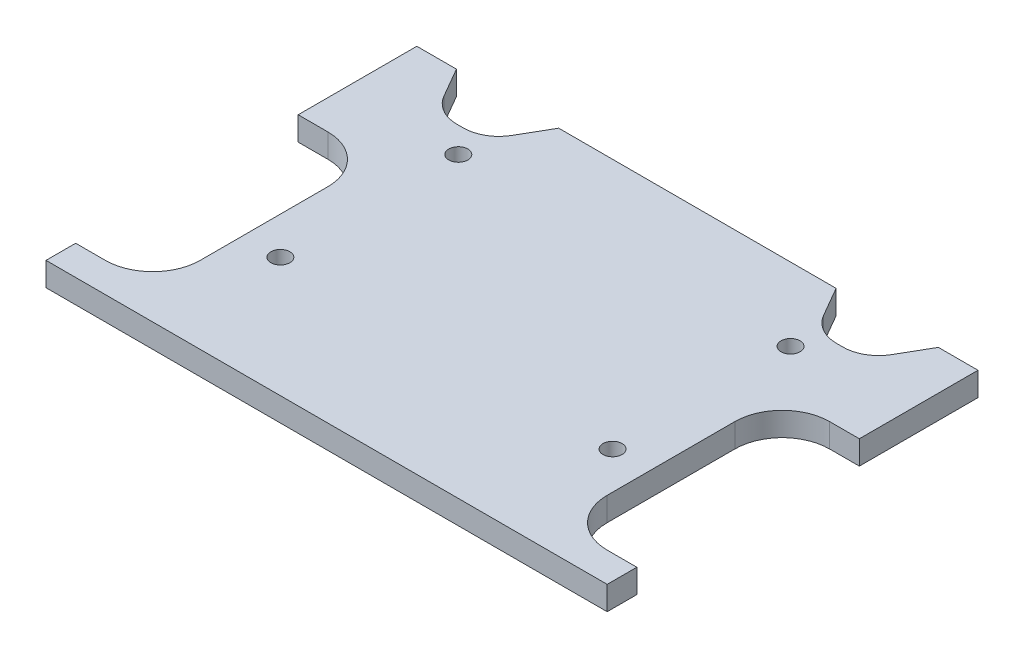
ISO-10303-21;
HEADER;
FILE_DESCRIPTION(('STEP AP214'),'2;1');
FILE_NAME('part.step','',(''),(''),'','','');
FILE_SCHEMA(('AUTOMOTIVE_DESIGN { 1 0 10303 214 1 1 1 1 }'));
ENDSEC;
DATA;
#1=APPLICATION_CONTEXT('core data for automotive mechanical design processes');
#2=APPLICATION_PROTOCOL_DEFINITION('international standard','automotive_design',2000,#1);
#3=PRODUCT_CONTEXT('',#1,'mechanical');
#4=PRODUCT('Part','Part','',(#3));
#5=PRODUCT_RELATED_PRODUCT_CATEGORY('part','',(#4));
#6=PRODUCT_DEFINITION_FORMATION('','',#4);
#7=PRODUCT_DEFINITION_CONTEXT('part definition',#1,'design');
#8=PRODUCT_DEFINITION('design','',#6,#7);
#9=PRODUCT_DEFINITION_SHAPE('','',#8);
#10=(LENGTH_UNIT() NAMED_UNIT(*) SI_UNIT(.MILLI.,.METRE.));
#11=(NAMED_UNIT(*) PLANE_ANGLE_UNIT() SI_UNIT($,.RADIAN.));
#12=(NAMED_UNIT(*) SI_UNIT($,.STERADIAN.) SOLID_ANGLE_UNIT());
#13=UNCERTAINTY_MEASURE_WITH_UNIT(LENGTH_MEASURE(1.E-05),#10,'distance_accuracy_value','');
#14=(GEOMETRIC_REPRESENTATION_CONTEXT(3) GLOBAL_UNCERTAINTY_ASSIGNED_CONTEXT((#13)) GLOBAL_UNIT_ASSIGNED_CONTEXT((#10,
#11,#12)) REPRESENTATION_CONTEXT('',''));
#15=CARTESIAN_POINT('',(0.,0.,0.));
#16=DIRECTION('',(0.,0.,1.));
#17=DIRECTION('',(1.,0.,0.));
#18=AXIS2_PLACEMENT_3D('',#15,#16,#17);
#19=CARTESIAN_POINT('',(-75.0855000000001,6.35,-27.7827342428377));
#20=DIRECTION('',(1.,0.,0.));
#21=DIRECTION('',(0.,0.,-1.));
#22=AXIS2_PLACEMENT_3D('',#19,#20,#21);
#23=PLANE('',#22);
#24=DIRECTION('',(0.,0.,1.));
#25=VECTOR('',#24,1.);
#26=CARTESIAN_POINT('',(-75.0855000000001,0.,-27.7827342428377));
#27=LINE('',#26,#25);
#28=CARTESIAN_POINT('',(-75.0855000000001,0.,-27.7827342428377));
#29=VERTEX_POINT('',#28);
#30=CARTESIAN_POINT('',(-75.0855000000001,0.,3.96726575716246));
#31=VERTEX_POINT('',#30);
#32=EDGE_CURVE('E256',#29,#31,#27,.T.);
#33=ORIENTED_EDGE('',*,*,#32,.T.);
#34=DIRECTION('',(0.,-1.,0.));
#35=VECTOR('',#34,1.);
#36=CARTESIAN_POINT('',(-75.0855000000001,6.35,3.96726575716246));
#37=LINE('',#36,#35);
#38=CARTESIAN_POINT('',(-75.0855000000001,6.35,3.96726575716246));
#39=VERTEX_POINT('',#38);
#40=EDGE_CURVE('E11',#39,#31,#37,.T.);
#41=ORIENTED_EDGE('',*,*,#40,.F.);
#42=DIRECTION('',(0.,0.,1.));
#43=VECTOR('',#42,1.);
#44=CARTESIAN_POINT('',(-75.0855000000001,6.35,-27.7827342428377));
#45=LINE('',#44,#43);
#46=CARTESIAN_POINT('',(-75.0855000000001,6.35,-27.7827342428377));
#47=VERTEX_POINT('',#46);
#48=EDGE_CURVE('E313',#47,#39,#45,.T.);
#49=ORIENTED_EDGE('',*,*,#48,.F.);
#50=DIRECTION('',(0.,-1.,0.));
#51=VECTOR('',#50,1.);
#52=CARTESIAN_POINT('',(-75.0855000000001,6.35,-27.7827342428377));
#53=LINE('',#52,#51);
#54=EDGE_CURVE('E252',#47,#29,#53,.T.);
#55=ORIENTED_EDGE('',*,*,#54,.T.);
#56=EDGE_LOOP('',(#33,#41,#49,#55));
#57=FACE_BOUND('',#56,.T.);
#58=ADVANCED_FACE('F39',(#57),#23,.F.);
#59=CARTESIAN_POINT('',(-75.0855000000001,6.35,3.96726575716246));
#60=DIRECTION('',(0.,0.,-1.));
#61=DIRECTION('',(-1.,0.,0.));
#62=AXIS2_PLACEMENT_3D('',#59,#60,#61);
#63=PLANE('',#62);
#64=DIRECTION('',(1.,0.,0.));
#65=VECTOR('',#64,1.);
#66=CARTESIAN_POINT('',(-75.0855000000001,0.,3.96726575716246));
#67=LINE('',#66,#65);
#68=CARTESIAN_POINT('',(-67.1480000000001,0.,3.96726575716246));
#69=VERTEX_POINT('',#68);
#70=EDGE_CURVE('E259',#31,#69,#67,.T.);
#71=ORIENTED_EDGE('',*,*,#70,.T.);
#72=DIRECTION('',(0.,-1.,0.));
#73=VECTOR('',#72,1.);
#74=CARTESIAN_POINT('',(-67.1480000000001,6.35,3.96726575716246));
#75=LINE('',#74,#73);
#76=CARTESIAN_POINT('',(-67.1480000000001,6.35,3.96726575716246));
#77=VERTEX_POINT('',#76);
#78=EDGE_CURVE('E47',#77,#69,#75,.T.);
#79=ORIENTED_EDGE('',*,*,#78,.F.);
#80=DIRECTION('',(1.,0.,0.));
#81=VECTOR('',#80,1.);
#82=CARTESIAN_POINT('',(-75.0855000000001,6.35,3.96726575716246));
#83=LINE('',#82,#81);
#84=EDGE_CURVE('E159',#39,#77,#83,.T.);
#85=ORIENTED_EDGE('',*,*,#84,.F.);
#86=ORIENTED_EDGE('',*,*,#40,.T.);
#87=EDGE_LOOP('',(#71,#79,#85,#86));
#88=FACE_BOUND('',#87,.T.);
#89=ADVANCED_FACE('F473',(#88),#63,.F.);
#90=CARTESIAN_POINT('',(-67.1480000000001,6.35,16.6672657571625));
#91=DIRECTION('',(0.,-1.,0.));
#92=DIRECTION('',(0.,0.,-1.));
#93=AXIS2_PLACEMENT_3D('',#90,#91,#92);
#94=CYLINDRICAL_SURFACE('',#93,12.7);
#95=CARTESIAN_POINT('',(-67.1480000000001,0.,16.6672657571625));
#96=DIRECTION('',(0.,-1.,0.));
#97=DIRECTION('',(0.,0.,1.));
#98=AXIS2_PLACEMENT_3D('',#95,#96,#97);
#99=CIRCLE('',#98,12.7);
#100=CARTESIAN_POINT('',(-54.4480000000001,0.,16.6672657571625));
#101=VERTEX_POINT('',#100);
#102=EDGE_CURVE('E262',#69,#101,#99,.T.);
#103=ORIENTED_EDGE('',*,*,#102,.T.);
#104=DIRECTION('',(0.,-1.,0.));
#105=VECTOR('',#104,1.);
#106=CARTESIAN_POINT('',(-54.4480000000001,6.35,16.6672657571625));
#107=LINE('',#106,#105);
#108=CARTESIAN_POINT('',(-54.4480000000001,6.35,16.6672657571625));
#109=VERTEX_POINT('',#108);
#110=EDGE_CURVE('E381',#109,#101,#107,.T.);
#111=ORIENTED_EDGE('',*,*,#110,.F.);
#112=CARTESIAN_POINT('',(-67.1480000000001,6.35,16.6672657571625));
#113=DIRECTION('',(0.,-1.,0.));
#114=DIRECTION('',(0.,0.,1.));
#115=AXIS2_PLACEMENT_3D('',#112,#113,#114);
#116=CIRCLE('',#115,12.7);
#117=EDGE_CURVE('E389',#77,#109,#116,.T.);
#118=ORIENTED_EDGE('',*,*,#117,.F.);
#119=ORIENTED_EDGE('',*,*,#78,.T.);
#120=EDGE_LOOP('',(#103,#111,#118,#119));
#121=FACE_BOUND('',#120,.T.);
#122=ADVANCED_FACE('F387',(#121),#94,.F.);
#123=CARTESIAN_POINT('',(-54.4480000000001,6.35,16.6672657571625));
#124=DIRECTION('',(1.,0.,0.));
#125=DIRECTION('',(0.,0.,-1.));
#126=AXIS2_PLACEMENT_3D('',#123,#124,#125);
#127=PLANE('',#126);
#128=DIRECTION('',(0.,0.,1.));
#129=VECTOR('',#128,1.);
#130=CARTESIAN_POINT('',(-54.4480000000001,0.,16.6672657571625));
#131=LINE('',#130,#129);
#132=CARTESIAN_POINT('',(-54.4480000000001,0.,50.8128909090899));
#133=VERTEX_POINT('',#132);
#134=EDGE_CURVE('E264',#101,#133,#131,.T.);
#135=ORIENTED_EDGE('',*,*,#134,.T.);
#136=DIRECTION('',(0.,-1.,0.));
#137=VECTOR('',#136,1.);
#138=CARTESIAN_POINT('',(-54.4480000000001,6.35,50.8128909090899));
#139=LINE('',#138,#137);
#140=CARTESIAN_POINT('',(-54.4480000000001,6.35,50.8128909090899));
#141=VERTEX_POINT('',#140);
#142=EDGE_CURVE('E378',#141,#133,#139,.T.);
#143=ORIENTED_EDGE('',*,*,#142,.F.);
#144=DIRECTION('',(0.,0.,1.));
#145=VECTOR('',#144,1.);
#146=CARTESIAN_POINT('',(-54.4480000000001,6.35,16.6672657571625));
#147=LINE('',#146,#145);
#148=EDGE_CURVE('E407',#109,#141,#147,.T.);
#149=ORIENTED_EDGE('',*,*,#148,.F.);
#150=ORIENTED_EDGE('',*,*,#110,.T.);
#151=EDGE_LOOP('',(#135,#143,#149,#150));
#152=FACE_BOUND('',#151,.T.);
#153=ADVANCED_FACE('F398',(#152),#127,.F.);
#154=CARTESIAN_POINT('',(-67.1480000000001,6.35,50.8128909090899));
#155=DIRECTION('',(0.,-1.,0.));
#156=DIRECTION('',(0.,0.,-1.));
#157=AXIS2_PLACEMENT_3D('',#154,#155,#156);
#158=CYLINDRICAL_SURFACE('',#157,12.7);
#159=CARTESIAN_POINT('',(-67.1480000000001,0.,50.8128909090899));
#160=DIRECTION('',(0.,-1.,0.));
#161=DIRECTION('',(0.,0.,1.));
#162=AXIS2_PLACEMENT_3D('',#159,#160,#161);
#163=CIRCLE('',#162,12.7);
#164=CARTESIAN_POINT('',(-67.1480000000001,0.,63.5128909090899));
#165=VERTEX_POINT('',#164);
#166=EDGE_CURVE('E266',#133,#165,#163,.T.);
#167=ORIENTED_EDGE('',*,*,#166,.T.);
#168=DIRECTION('',(0.,-1.,0.));
#169=VECTOR('',#168,1.);
#170=CARTESIAN_POINT('',(-67.1480000000001,6.35,63.5128909090899));
#171=LINE('',#170,#169);
#172=CARTESIAN_POINT('',(-67.1480000000001,6.35,63.5128909090899));
#173=VERTEX_POINT('',#172);
#174=EDGE_CURVE('E375',#173,#165,#171,.T.);
#175=ORIENTED_EDGE('',*,*,#174,.F.);
#176=CARTESIAN_POINT('',(-67.1480000000001,6.35,50.8128909090899));
#177=DIRECTION('',(0.,-1.,0.));
#178=DIRECTION('',(0.,0.,1.));
#179=AXIS2_PLACEMENT_3D('',#176,#177,#178);
#180=CIRCLE('',#179,12.7);
#181=EDGE_CURVE('E404',#141,#173,#180,.T.);
#182=ORIENTED_EDGE('',*,*,#181,.F.);
#183=ORIENTED_EDGE('',*,*,#142,.T.);
#184=EDGE_LOOP('',(#167,#175,#182,#183));
#185=FACE_BOUND('',#184,.T.);
#186=ADVANCED_FACE('F402',(#185),#158,.F.);
#187=CARTESIAN_POINT('',(-67.1480000000001,6.35,63.5128909090899));
#188=DIRECTION('',(0.,0.,1.));
#189=DIRECTION('',(1.,0.,0.));
#190=AXIS2_PLACEMENT_3D('',#187,#188,#189);
#191=PLANE('',#190);
#192=DIRECTION('',(-1.,0.,0.));
#193=VECTOR('',#192,1.);
#194=CARTESIAN_POINT('',(-67.1480000000001,0.,63.5128909090899));
#195=LINE('',#194,#193);
#196=CARTESIAN_POINT('',(-75.0855000000001,0.,63.5128909090899));
#197=VERTEX_POINT('',#196);
#198=EDGE_CURVE('E268',#165,#197,#195,.T.);
#199=ORIENTED_EDGE('',*,*,#198,.T.);
#200=DIRECTION('',(0.,-1.,0.));
#201=VECTOR('',#200,1.);
#202=CARTESIAN_POINT('',(-75.0855000000001,6.35,63.5128909090899));
#203=LINE('',#202,#201);
#204=CARTESIAN_POINT('',(-75.0855000000001,6.35,63.5128909090899));
#205=VERTEX_POINT('',#204);
#206=EDGE_CURVE('E372',#205,#197,#203,.T.);
#207=ORIENTED_EDGE('',*,*,#206,.F.);
#208=DIRECTION('',(-1.,0.,0.));
#209=VECTOR('',#208,1.);
#210=CARTESIAN_POINT('',(-67.1480000000001,6.35,63.5128909090899));
#211=LINE('',#210,#209);
#212=EDGE_CURVE('E406',#173,#205,#211,.T.);
#213=ORIENTED_EDGE('',*,*,#212,.F.);
#214=ORIENTED_EDGE('',*,*,#174,.T.);
#215=EDGE_LOOP('',(#199,#207,#213,#214));
#216=FACE_BOUND('',#215,.T.);
#217=ADVANCED_FACE('F486',(#216),#191,.F.);
#218=CARTESIAN_POINT('',(-75.0855000000001,6.35,63.5128909090899));
#219=DIRECTION('',(1.,0.,0.));
#220=DIRECTION('',(0.,0.,-1.));
#221=AXIS2_PLACEMENT_3D('',#218,#219,#220);
#222=PLANE('',#221);
#223=DIRECTION('',(0.,0.,1.));
#224=VECTOR('',#223,1.);
#225=CARTESIAN_POINT('',(-75.0855000000001,0.,63.5128909090899));
#226=LINE('',#225,#224);
#227=CARTESIAN_POINT('',(-75.0855000000001,0.,71.4503909090898));
#228=VERTEX_POINT('',#227);
#229=EDGE_CURVE('E270',#197,#228,#226,.T.);
#230=ORIENTED_EDGE('',*,*,#229,.T.);
#231=DIRECTION('',(0.,-1.,0.));
#232=VECTOR('',#231,1.);
#233=CARTESIAN_POINT('',(-75.0855000000001,6.35,71.4503909090898));
#234=LINE('',#233,#232);
#235=CARTESIAN_POINT('',(-75.0855000000001,6.35,71.4503909090898));
#236=VERTEX_POINT('',#235);
#237=EDGE_CURVE('E369',#236,#228,#234,.T.);
#238=ORIENTED_EDGE('',*,*,#237,.F.);
#239=DIRECTION('',(0.,0.,1.));
#240=VECTOR('',#239,1.);
#241=CARTESIAN_POINT('',(-75.0855000000001,6.35,63.5128909090899));
#242=LINE('',#241,#240);
#243=EDGE_CURVE('E409',#205,#236,#242,.T.);
#244=ORIENTED_EDGE('',*,*,#243,.F.);
#245=ORIENTED_EDGE('',*,*,#206,.T.);
#246=EDGE_LOOP('',(#230,#238,#244,#245));
#247=FACE_BOUND('',#246,.T.);
#248=ADVANCED_FACE('F489',(#247),#222,.F.);
#249=CARTESIAN_POINT('',(-75.0855000000001,6.35,71.4503909090898));
#250=DIRECTION('',(0.,0.,-1.));
#251=DIRECTION('',(-1.,0.,0.));
#252=AXIS2_PLACEMENT_3D('',#249,#250,#251);
#253=PLANE('',#252);
#254=DIRECTION('',(1.,0.,0.));
#255=VECTOR('',#254,1.);
#256=CARTESIAN_POINT('',(-75.0855000000001,0.,71.4503909090898));
#257=LINE('',#256,#255);
#258=CARTESIAN_POINT('',(75.0855000000001,0.,71.4503909090898));
#259=VERTEX_POINT('',#258);
#260=EDGE_CURVE('E272',#228,#259,#257,.T.);
#261=ORIENTED_EDGE('',*,*,#260,.T.);
#262=DIRECTION('',(0.,-1.,0.));
#263=VECTOR('',#262,1.);
#264=CARTESIAN_POINT('',(75.0855000000001,6.35,71.4503909090898));
#265=LINE('',#264,#263);
#266=CARTESIAN_POINT('',(75.0855000000001,6.35,71.4503909090898));
#267=VERTEX_POINT('',#266);
#268=EDGE_CURVE('E366',#267,#259,#265,.T.);
#269=ORIENTED_EDGE('',*,*,#268,.F.);
#270=DIRECTION('',(1.,0.,0.));
#271=VECTOR('',#270,1.);
#272=CARTESIAN_POINT('',(-75.0855000000001,6.35,71.4503909090898));
#273=LINE('',#272,#271);
#274=EDGE_CURVE('E415',#236,#267,#273,.T.);
#275=ORIENTED_EDGE('',*,*,#274,.F.);
#276=ORIENTED_EDGE('',*,*,#237,.T.);
#277=EDGE_LOOP('',(#261,#269,#275,#276));
#278=FACE_BOUND('',#277,.T.);
#279=ADVANCED_FACE('F493',(#278),#253,.F.);
#280=CARTESIAN_POINT('',(75.0855000000001,6.35,71.4503909090898));
#281=DIRECTION('',(-1.,0.,0.));
#282=DIRECTION('',(0.,0.,1.));
#283=AXIS2_PLACEMENT_3D('',#280,#281,#282);
#284=PLANE('',#283);
#285=DIRECTION('',(0.,0.,-1.));
#286=VECTOR('',#285,1.);
#287=CARTESIAN_POINT('',(75.0855000000001,0.,71.4503909090898));
#288=LINE('',#287,#286);
#289=CARTESIAN_POINT('',(75.0855000000001,0.,63.5128909090898));
#290=VERTEX_POINT('',#289);
#291=EDGE_CURVE('E274',#259,#290,#288,.T.);
#292=ORIENTED_EDGE('',*,*,#291,.T.);
#293=DIRECTION('',(0.,-1.,0.));
#294=VECTOR('',#293,1.);
#295=CARTESIAN_POINT('',(75.0855000000001,6.35,63.5128909090898));
#296=LINE('',#295,#294);
#297=CARTESIAN_POINT('',(75.0855000000001,6.35,63.5128909090898));
#298=VERTEX_POINT('',#297);
#299=EDGE_CURVE('E363',#298,#290,#296,.T.);
#300=ORIENTED_EDGE('',*,*,#299,.F.);
#301=DIRECTION('',(0.,0.,-1.));
#302=VECTOR('',#301,1.);
#303=CARTESIAN_POINT('',(75.0855000000001,6.35,71.4503909090898));
#304=LINE('',#303,#302);
#305=EDGE_CURVE('E417',#267,#298,#304,.T.);
#306=ORIENTED_EDGE('',*,*,#305,.F.);
#307=ORIENTED_EDGE('',*,*,#268,.T.);
#308=EDGE_LOOP('',(#292,#300,#306,#307));
#309=FACE_BOUND('',#308,.T.);
#310=ADVANCED_FACE('F497',(#309),#284,.F.);
#311=CARTESIAN_POINT('',(75.0855000000001,6.35,63.5128909090898));
#312=DIRECTION('',(0.,0.,1.));
#313=DIRECTION('',(1.,0.,0.));
#314=AXIS2_PLACEMENT_3D('',#311,#312,#313);
#315=PLANE('',#314);
#316=DIRECTION('',(-1.,0.,0.));
#317=VECTOR('',#316,1.);
#318=CARTESIAN_POINT('',(75.0855000000001,0.,63.5128909090898));
#319=LINE('',#318,#317);
#320=CARTESIAN_POINT('',(67.1480000000001,0.,63.5128909090898));
#321=VERTEX_POINT('',#320);
#322=EDGE_CURVE('E276',#290,#321,#319,.T.);
#323=ORIENTED_EDGE('',*,*,#322,.T.);
#324=DIRECTION('',(0.,-1.,0.));
#325=VECTOR('',#324,1.);
#326=CARTESIAN_POINT('',(67.1480000000001,6.35,63.5128909090898));
#327=LINE('',#326,#325);
#328=CARTESIAN_POINT('',(67.1480000000001,6.35,63.5128909090898));
#329=VERTEX_POINT('',#328);
#330=EDGE_CURVE('E360',#329,#321,#327,.T.);
#331=ORIENTED_EDGE('',*,*,#330,.F.);
#332=DIRECTION('',(-1.,0.,0.));
#333=VECTOR('',#332,1.);
#334=CARTESIAN_POINT('',(75.0855000000001,6.35,63.5128909090898));
#335=LINE('',#334,#333);
#336=EDGE_CURVE('E419',#298,#329,#335,.T.);
#337=ORIENTED_EDGE('',*,*,#336,.F.);
#338=ORIENTED_EDGE('',*,*,#299,.T.);
#339=EDGE_LOOP('',(#323,#331,#337,#338));
#340=FACE_BOUND('',#339,.T.);
#341=ADVANCED_FACE('F501',(#340),#315,.F.);
#342=CARTESIAN_POINT('',(67.1480000000001,6.35,50.8128909090898));
#343=DIRECTION('',(0.,-1.,0.));
#344=DIRECTION('',(0.,0.,-1.));
#345=AXIS2_PLACEMENT_3D('',#342,#343,#344);
#346=CYLINDRICAL_SURFACE('',#345,12.7);
#347=CARTESIAN_POINT('',(67.1480000000001,0.,50.8128909090898));
#348=DIRECTION('',(0.,-1.,0.));
#349=DIRECTION('',(0.,0.,-1.));
#350=AXIS2_PLACEMENT_3D('',#347,#348,#349);
#351=CIRCLE('',#350,12.7);
#352=CARTESIAN_POINT('',(54.4480000000001,0.,50.8128909090898));
#353=VERTEX_POINT('',#352);
#354=EDGE_CURVE('E278',#321,#353,#351,.T.);
#355=ORIENTED_EDGE('',*,*,#354,.T.);
#356=DIRECTION('',(0.,-1.,0.));
#357=VECTOR('',#356,1.);
#358=CARTESIAN_POINT('',(54.4480000000001,6.35,50.8128909090898));
#359=LINE('',#358,#357);
#360=CARTESIAN_POINT('',(54.4480000000001,6.35,50.8128909090898));
#361=VERTEX_POINT('',#360);
#362=EDGE_CURVE('E357',#361,#353,#359,.T.);
#363=ORIENTED_EDGE('',*,*,#362,.F.);
#364=CARTESIAN_POINT('',(67.1480000000001,6.35,50.8128909090898));
#365=DIRECTION('',(0.,-1.,0.));
#366=DIRECTION('',(0.,0.,-1.));
#367=AXIS2_PLACEMENT_3D('',#364,#365,#366);
#368=CIRCLE('',#367,12.7);
#369=EDGE_CURVE('E421',#329,#361,#368,.T.);
#370=ORIENTED_EDGE('',*,*,#369,.F.);
#371=ORIENTED_EDGE('',*,*,#330,.T.);
#372=EDGE_LOOP('',(#355,#363,#370,#371));
#373=FACE_BOUND('',#372,.T.);
#374=ADVANCED_FACE('F505',(#373),#346,.F.);
#375=CARTESIAN_POINT('',(54.4480000000001,6.35,50.8128909090898));
#376=DIRECTION('',(-1.,0.,0.));
#377=DIRECTION('',(0.,0.,1.));
#378=AXIS2_PLACEMENT_3D('',#375,#376,#377);
#379=PLANE('',#378);
#380=DIRECTION('',(0.,0.,-1.));
#381=VECTOR('',#380,1.);
#382=CARTESIAN_POINT('',(54.4480000000001,0.,50.8128909090898));
#383=LINE('',#382,#381);
#384=CARTESIAN_POINT('',(54.4480000000001,0.,16.6672657571625));
#385=VERTEX_POINT('',#384);
#386=EDGE_CURVE('E280',#353,#385,#383,.T.);
#387=ORIENTED_EDGE('',*,*,#386,.T.);
#388=DIRECTION('',(0.,-1.,0.));
#389=VECTOR('',#388,1.);
#390=CARTESIAN_POINT('',(54.4480000000001,6.35,16.6672657571625));
#391=LINE('',#390,#389);
#392=CARTESIAN_POINT('',(54.4480000000001,6.35,16.6672657571625));
#393=VERTEX_POINT('',#392);
#394=EDGE_CURVE('E354',#393,#385,#391,.T.);
#395=ORIENTED_EDGE('',*,*,#394,.F.);
#396=DIRECTION('',(0.,0.,-1.));
#397=VECTOR('',#396,1.);
#398=CARTESIAN_POINT('',(54.4480000000001,6.35,50.8128909090898));
#399=LINE('',#398,#397);
#400=EDGE_CURVE('E423',#361,#393,#399,.T.);
#401=ORIENTED_EDGE('',*,*,#400,.F.);
#402=ORIENTED_EDGE('',*,*,#362,.T.);
#403=EDGE_LOOP('',(#387,#395,#401,#402));
#404=FACE_BOUND('',#403,.T.);
#405=ADVANCED_FACE('F509',(#404),#379,.F.);
#406=CARTESIAN_POINT('',(67.1480000000001,6.35,16.6672657571625));
#407=DIRECTION('',(0.,-1.,0.));
#408=DIRECTION('',(0.,0.,-1.));
#409=AXIS2_PLACEMENT_3D('',#406,#407,#408);
#410=CYLINDRICAL_SURFACE('',#409,12.7);
#411=CARTESIAN_POINT('',(67.1480000000001,0.,16.6672657571625));
#412=DIRECTION('',(0.,-1.,0.));
#413=DIRECTION('',(0.,0.,1.));
#414=AXIS2_PLACEMENT_3D('',#411,#412,#413);
#415=CIRCLE('',#414,12.7);
#416=CARTESIAN_POINT('',(67.1480000000001,0.,3.96726575716246));
#417=VERTEX_POINT('',#416);
#418=EDGE_CURVE('E282',#385,#417,#415,.T.);
#419=ORIENTED_EDGE('',*,*,#418,.T.);
#420=DIRECTION('',(0.,-1.,0.));
#421=VECTOR('',#420,1.);
#422=CARTESIAN_POINT('',(67.1480000000001,6.35,3.96726575716246));
#423=LINE('',#422,#421);
#424=CARTESIAN_POINT('',(67.1480000000001,6.35,3.96726575716246));
#425=VERTEX_POINT('',#424);
#426=EDGE_CURVE('E351',#425,#417,#423,.T.);
#427=ORIENTED_EDGE('',*,*,#426,.F.);
#428=CARTESIAN_POINT('',(67.1480000000001,6.35,16.6672657571625));
#429=DIRECTION('',(0.,-1.,0.));
#430=DIRECTION('',(0.,0.,1.));
#431=AXIS2_PLACEMENT_3D('',#428,#429,#430);
#432=CIRCLE('',#431,12.7);
#433=EDGE_CURVE('E425',#393,#425,#432,.T.);
#434=ORIENTED_EDGE('',*,*,#433,.F.);
#435=ORIENTED_EDGE('',*,*,#394,.T.);
#436=EDGE_LOOP('',(#419,#427,#434,#435));
#437=FACE_BOUND('',#436,.T.);
#438=ADVANCED_FACE('F513',(#437),#410,.F.);
#439=CARTESIAN_POINT('',(67.1480000000001,6.35,3.96726575716246));
#440=DIRECTION('',(0.,0.,-1.));
#441=DIRECTION('',(-1.,0.,0.));
#442=AXIS2_PLACEMENT_3D('',#439,#440,#441);
#443=PLANE('',#442);
#444=DIRECTION('',(1.,0.,0.));
#445=VECTOR('',#444,1.);
#446=CARTESIAN_POINT('',(67.1480000000001,0.,3.96726575716246));
#447=LINE('',#446,#445);
#448=CARTESIAN_POINT('',(75.0855000000001,0.,3.96726575716246));
#449=VERTEX_POINT('',#448);
#450=EDGE_CURVE('E284',#417,#449,#447,.T.);
#451=ORIENTED_EDGE('',*,*,#450,.T.);
#452=DIRECTION('',(0.,-1.,0.));
#453=VECTOR('',#452,1.);
#454=CARTESIAN_POINT('',(75.0855000000001,6.35,3.96726575716246));
#455=LINE('',#454,#453);
#456=CARTESIAN_POINT('',(75.0855000000001,6.35,3.96726575716246));
#457=VERTEX_POINT('',#456);
#458=EDGE_CURVE('E348',#457,#449,#455,.T.);
#459=ORIENTED_EDGE('',*,*,#458,.F.);
#460=DIRECTION('',(1.,0.,0.));
#461=VECTOR('',#460,1.);
#462=CARTESIAN_POINT('',(67.1480000000001,6.35,3.96726575716246));
#463=LINE('',#462,#461);
#464=EDGE_CURVE('E427',#425,#457,#463,.T.);
#465=ORIENTED_EDGE('',*,*,#464,.F.);
#466=ORIENTED_EDGE('',*,*,#426,.T.);
#467=EDGE_LOOP('',(#451,#459,#465,#466));
#468=FACE_BOUND('',#467,.T.);
#469=ADVANCED_FACE('F517',(#468),#443,.F.);
#470=CARTESIAN_POINT('',(75.0855000000001,6.35,-27.7827342428377));
#471=DIRECTION('',(-1.,0.,0.));
#472=DIRECTION('',(0.,0.,1.));
#473=AXIS2_PLACEMENT_3D('',#470,#471,#472);
#474=PLANE('',#473);
#475=DIRECTION('',(0.,0.,-1.));
#476=VECTOR('',#475,1.);
#477=CARTESIAN_POINT('',(75.0855000000001,0.,-27.7827342428377));
#478=LINE('',#477,#476);
#479=CARTESIAN_POINT('',(75.0855000000001,0.,-27.7827342428377));
#480=VERTEX_POINT('',#479);
#481=EDGE_CURVE('E286',#449,#480,#478,.T.);
#482=ORIENTED_EDGE('',*,*,#481,.T.);
#483=DIRECTION('',(0.,-1.,0.));
#484=VECTOR('',#483,1.);
#485=CARTESIAN_POINT('',(75.0855000000001,6.35,-27.7827342428377));
#486=LINE('',#485,#484);
#487=CARTESIAN_POINT('',(75.0855000000001,6.35,-27.7827342428377));
#488=VERTEX_POINT('',#487);
#489=EDGE_CURVE('E345',#488,#480,#486,.T.);
#490=ORIENTED_EDGE('',*,*,#489,.F.);
#491=DIRECTION('',(0.,0.,-1.));
#492=VECTOR('',#491,1.);
#493=CARTESIAN_POINT('',(75.0855000000001,6.35,-27.7827342428377));
#494=LINE('',#493,#492);
#495=EDGE_CURVE('E429',#457,#488,#494,.T.);
#496=ORIENTED_EDGE('',*,*,#495,.F.);
#497=ORIENTED_EDGE('',*,*,#458,.T.);
#498=EDGE_LOOP('',(#482,#490,#496,#497));
#499=FACE_BOUND('',#498,.T.);
#500=ADVANCED_FACE('F521',(#499),#474,.F.);
#501=CARTESIAN_POINT('',(64.4823484187082,6.35,-27.7827342428377));
#502=DIRECTION('',(0.,0.,1.));
#503=DIRECTION('',(1.,0.,0.));
#504=AXIS2_PLACEMENT_3D('',#501,#502,#503);
#505=PLANE('',#504);
#506=DIRECTION('',(-1.,0.,0.));
#507=VECTOR('',#506,1.);
#508=CARTESIAN_POINT('',(64.4823484187082,0.,-27.7827342428377));
#509=LINE('',#508,#507);
#510=CARTESIAN_POINT('',(64.4823484187082,0.,-27.7827342428377));
#511=VERTEX_POINT('',#510);
#512=EDGE_CURVE('E288',#480,#511,#509,.T.);
#513=ORIENTED_EDGE('',*,*,#512,.T.);
#514=DIRECTION('',(0.,-1.,0.));
#515=VECTOR('',#514,1.);
#516=CARTESIAN_POINT('',(64.4823484187082,6.35,-27.7827342428377));
#517=LINE('',#516,#515);
#518=CARTESIAN_POINT('',(64.4823484187082,6.35,-27.7827342428377));
#519=VERTEX_POINT('',#518);
#520=EDGE_CURVE('E342',#519,#511,#517,.T.);
#521=ORIENTED_EDGE('',*,*,#520,.F.);
#522=DIRECTION('',(-1.,0.,0.));
#523=VECTOR('',#522,1.);
#524=CARTESIAN_POINT('',(64.4823484187082,6.35,-27.7827342428377));
#525=LINE('',#524,#523);
#526=EDGE_CURVE('E431',#488,#519,#525,.T.);
#527=ORIENTED_EDGE('',*,*,#526,.F.);
#528=ORIENTED_EDGE('',*,*,#489,.T.);
#529=EDGE_LOOP('',(#513,#521,#527,#528));
#530=FACE_BOUND('',#529,.T.);
#531=ADVANCED_FACE('F525',(#530),#505,.F.);
#532=CARTESIAN_POINT('',(59.8996306570156,6.35,-19.8452342428377));
#533=DIRECTION('',(0.86602540378444,0.,0.499999999999998));
#534=DIRECTION('',(0.499999999999998,0.,-0.86602540378444));
#535=AXIS2_PLACEMENT_3D('',#532,#533,#534);
#536=PLANE('',#535);
#537=DIRECTION('',(-0.499999999999998,0.,0.86602540378444));
#538=VECTOR('',#537,1.);
#539=CARTESIAN_POINT('',(59.8996306570156,0.,-19.8452342428377));
#540=LINE('',#539,#538);
#541=CARTESIAN_POINT('',(59.8996306570156,0.,-19.8452342428377));
#542=VERTEX_POINT('',#541);
#543=EDGE_CURVE('E290',#511,#542,#540,.T.);
#544=ORIENTED_EDGE('',*,*,#543,.T.);
#545=DIRECTION('',(0.,-1.,0.));
#546=VECTOR('',#545,1.);
#547=CARTESIAN_POINT('',(59.8996306570156,6.35,-19.8452342428377));
#548=LINE('',#547,#546);
#549=CARTESIAN_POINT('',(59.8996306570156,6.35,-19.8452342428377));
#550=VERTEX_POINT('',#549);
#551=EDGE_CURVE('E339',#550,#542,#548,.T.);
#552=ORIENTED_EDGE('',*,*,#551,.F.);
#553=DIRECTION('',(-0.499999999999998,0.,0.86602540378444));
#554=VECTOR('',#553,1.);
#555=CARTESIAN_POINT('',(59.8996306570156,6.35,-19.8452342428377));
#556=LINE('',#555,#554);
#557=EDGE_CURVE('E433',#519,#550,#556,.T.);
#558=ORIENTED_EDGE('',*,*,#557,.F.);
#559=ORIENTED_EDGE('',*,*,#520,.T.);
#560=EDGE_LOOP('',(#544,#552,#558,#559));
#561=FACE_BOUND('',#560,.T.);
#562=ADVANCED_FACE('F529',(#561),#536,.F.);
#563=CARTESIAN_POINT('',(51.6507386859688,6.35,-24.6077342428377));
#564=DIRECTION('',(0.,-1.,0.));
#565=DIRECTION('',(0.,0.,-1.));
#566=AXIS2_PLACEMENT_3D('',#563,#564,#565);
#567=CYLINDRICAL_SURFACE('',#566,9.525);
#568=CARTESIAN_POINT('',(51.6507386859688,0.,-24.6077342428377));
#569=DIRECTION('',(0.,-1.,0.));
#570=DIRECTION('',(0.,0.,1.));
#571=AXIS2_PLACEMENT_3D('',#568,#569,#570);
#572=CIRCLE('',#571,9.525);
#573=CARTESIAN_POINT('',(51.6507386859688,0.,-15.0827342428377));
#574=VERTEX_POINT('',#573);
#575=EDGE_CURVE('E292',#542,#574,#572,.T.);
#576=ORIENTED_EDGE('',*,*,#575,.T.);
#577=DIRECTION('',(0.,-1.,0.));
#578=VECTOR('',#577,1.);
#579=CARTESIAN_POINT('',(51.6507386859688,6.35,-15.0827342428377));
#580=LINE('',#579,#578);
#581=CARTESIAN_POINT('',(51.6507386859688,6.35,-15.0827342428377));
#582=VERTEX_POINT('',#581);
#583=EDGE_CURVE('E336',#582,#574,#580,.T.);
#584=ORIENTED_EDGE('',*,*,#583,.F.);
#585=CARTESIAN_POINT('',(51.6507386859688,6.35,-24.6077342428377));
#586=DIRECTION('',(0.,-1.,0.));
#587=DIRECTION('',(0.,0.,1.));
#588=AXIS2_PLACEMENT_3D('',#585,#586,#587);
#589=CIRCLE('',#588,9.525);
#590=EDGE_CURVE('E435',#550,#582,#589,.T.);
#591=ORIENTED_EDGE('',*,*,#590,.F.);
#592=ORIENTED_EDGE('',*,*,#551,.T.);
#593=EDGE_LOOP('',(#576,#584,#591,#592));
#594=FACE_BOUND('',#593,.T.);
#595=ADVANCED_FACE('F533',(#594),#567,.F.);
#596=CARTESIAN_POINT('',(49.9492613140312,6.35,-15.0827342428377));
#597=DIRECTION('',(0.,0.,1.));
#598=DIRECTION('',(1.,0.,0.));
#599=AXIS2_PLACEMENT_3D('',#596,#597,#598);
#600=PLANE('',#599);
#601=DIRECTION('',(-1.,0.,0.));
#602=VECTOR('',#601,1.);
#603=CARTESIAN_POINT('',(49.9492613140312,0.,-15.0827342428377));
#604=LINE('',#603,#602);
#605=CARTESIAN_POINT('',(49.9492613140312,0.,-15.0827342428377));
#606=VERTEX_POINT('',#605);
#607=EDGE_CURVE('E294',#574,#606,#604,.T.);
#608=ORIENTED_EDGE('',*,*,#607,.T.);
#609=DIRECTION('',(0.,-1.,0.));
#610=VECTOR('',#609,1.);
#611=CARTESIAN_POINT('',(49.9492613140312,6.35,-15.0827342428377));
#612=LINE('',#611,#610);
#613=CARTESIAN_POINT('',(49.9492613140312,6.35,-15.0827342428377));
#614=VERTEX_POINT('',#613);
#615=EDGE_CURVE('E333',#614,#606,#612,.T.);
#616=ORIENTED_EDGE('',*,*,#615,.F.);
#617=DIRECTION('',(-1.,0.,0.));
#618=VECTOR('',#617,1.);
#619=CARTESIAN_POINT('',(49.9492613140312,6.35,-15.0827342428377));
#620=LINE('',#619,#618);
#621=EDGE_CURVE('E437',#582,#614,#620,.T.);
#622=ORIENTED_EDGE('',*,*,#621,.F.);
#623=ORIENTED_EDGE('',*,*,#583,.T.);
#624=EDGE_LOOP('',(#608,#616,#622,#623));
#625=FACE_BOUND('',#624,.T.);
#626=ADVANCED_FACE('F537',(#625),#600,.F.);
#627=CARTESIAN_POINT('',(49.9492613140312,6.35,-24.6077342428377));
#628=DIRECTION('',(0.,-1.,0.));
#629=DIRECTION('',(0.,0.,-1.));
#630=AXIS2_PLACEMENT_3D('',#627,#628,#629);
#631=CYLINDRICAL_SURFACE('',#630,9.525);
#632=CARTESIAN_POINT('',(49.9492613140312,0.,-24.6077342428377));
#633=DIRECTION('',(0.,-1.,0.));
#634=DIRECTION('',(0.,0.,1.));
#635=AXIS2_PLACEMENT_3D('',#632,#633,#634);
#636=CIRCLE('',#635,9.525);
#637=CARTESIAN_POINT('',(41.7003693429844,0.,-19.8452342428377));
#638=VERTEX_POINT('',#637);
#639=EDGE_CURVE('E296',#606,#638,#636,.T.);
#640=ORIENTED_EDGE('',*,*,#639,.T.);
#641=DIRECTION('',(0.,-1.,0.));
#642=VECTOR('',#641,1.);
#643=CARTESIAN_POINT('',(41.7003693429844,6.35,-19.8452342428377));
#644=LINE('',#643,#642);
#645=CARTESIAN_POINT('',(41.7003693429844,6.35,-19.8452342428377));
#646=VERTEX_POINT('',#645);
#647=EDGE_CURVE('E330',#646,#638,#644,.T.);
#648=ORIENTED_EDGE('',*,*,#647,.F.);
#649=CARTESIAN_POINT('',(49.9492613140312,6.35,-24.6077342428377));
#650=DIRECTION('',(0.,-1.,0.));
#651=DIRECTION('',(0.,0.,1.));
#652=AXIS2_PLACEMENT_3D('',#649,#650,#651);
#653=CIRCLE('',#652,9.525);
#654=EDGE_CURVE('E439',#614,#646,#653,.T.);
#655=ORIENTED_EDGE('',*,*,#654,.F.);
#656=ORIENTED_EDGE('',*,*,#615,.T.);
#657=EDGE_LOOP('',(#640,#648,#655,#656));
#658=FACE_BOUND('',#657,.T.);
#659=ADVANCED_FACE('F541',(#658),#631,.F.);
#660=CARTESIAN_POINT('',(37.1176515812918,6.35,-27.7827342428377));
#661=DIRECTION('',(-0.86602540378444,0.,0.499999999999997));
#662=DIRECTION('',(0.499999999999997,0.,0.86602540378444));
#663=AXIS2_PLACEMENT_3D('',#660,#661,#662);
#664=PLANE('',#663);
#665=DIRECTION('',(-0.499999999999997,0.,-0.86602540378444));
#666=VECTOR('',#665,1.);
#667=CARTESIAN_POINT('',(37.1176515812918,0.,-27.7827342428377));
#668=LINE('',#667,#666);
#669=CARTESIAN_POINT('',(37.1176515812918,0.,-27.7827342428377));
#670=VERTEX_POINT('',#669);
#671=EDGE_CURVE('E298',#638,#670,#668,.T.);
#672=ORIENTED_EDGE('',*,*,#671,.T.);
#673=DIRECTION('',(0.,-1.,0.));
#674=VECTOR('',#673,1.);
#675=CARTESIAN_POINT('',(37.1176515812918,6.35,-27.7827342428377));
#676=LINE('',#675,#674);
#677=CARTESIAN_POINT('',(37.1176515812918,6.35,-27.7827342428377));
#678=VERTEX_POINT('',#677);
#679=EDGE_CURVE('E327',#678,#670,#676,.T.);
#680=ORIENTED_EDGE('',*,*,#679,.F.);
#681=DIRECTION('',(-0.499999999999997,0.,-0.86602540378444));
#682=VECTOR('',#681,1.);
#683=CARTESIAN_POINT('',(37.1176515812918,6.35,-27.7827342428377));
#684=LINE('',#683,#682);
#685=EDGE_CURVE('E441',#646,#678,#684,.T.);
#686=ORIENTED_EDGE('',*,*,#685,.F.);
#687=ORIENTED_EDGE('',*,*,#647,.T.);
#688=EDGE_LOOP('',(#672,#680,#686,#687));
#689=FACE_BOUND('',#688,.T.);
#690=ADVANCED_FACE('F545',(#689),#664,.F.);
#691=CARTESIAN_POINT('',(-37.1176515812918,6.35,-27.7827342428377));
#692=DIRECTION('',(0.,0.,1.));
#693=DIRECTION('',(1.,0.,0.));
#694=AXIS2_PLACEMENT_3D('',#691,#692,#693);
#695=PLANE('',#694);
#696=DIRECTION('',(-1.,0.,0.));
#697=VECTOR('',#696,1.);
#698=CARTESIAN_POINT('',(-37.1176515812918,0.,-27.7827342428377));
#699=LINE('',#698,#697);
#700=CARTESIAN_POINT('',(-37.1176515812918,0.,-27.7827342428377));
#701=VERTEX_POINT('',#700);
#702=EDGE_CURVE('E300',#670,#701,#699,.T.);
#703=ORIENTED_EDGE('',*,*,#702,.T.);
#704=DIRECTION('',(0.,-1.,0.));
#705=VECTOR('',#704,1.);
#706=CARTESIAN_POINT('',(-37.1176515812918,6.35,-27.7827342428377));
#707=LINE('',#706,#705);
#708=CARTESIAN_POINT('',(-37.1176515812918,6.35,-27.7827342428377));
#709=VERTEX_POINT('',#708);
#710=EDGE_CURVE('E323',#709,#701,#707,.T.);
#711=ORIENTED_EDGE('',*,*,#710,.F.);
#712=DIRECTION('',(-1.,0.,0.));
#713=VECTOR('',#712,1.);
#714=CARTESIAN_POINT('',(-37.1176515812918,6.35,-27.7827342428377));
#715=LINE('',#714,#713);
#716=EDGE_CURVE('E443',#678,#709,#715,.T.);
#717=ORIENTED_EDGE('',*,*,#716,.F.);
#718=ORIENTED_EDGE('',*,*,#679,.T.);
#719=EDGE_LOOP('',(#703,#711,#717,#718));
#720=FACE_BOUND('',#719,.T.);
#721=ADVANCED_FACE('F549',(#720),#695,.F.);
#722=CARTESIAN_POINT('',(-41.7003693429844,6.35,-19.8452342428377));
#723=DIRECTION('',(0.86602540378444,0.,0.499999999999998));
#724=DIRECTION('',(0.499999999999998,0.,-0.86602540378444));
#725=AXIS2_PLACEMENT_3D('',#722,#723,#724);
#726=PLANE('',#725);
#727=DIRECTION('',(-0.499999999999998,0.,0.86602540378444));
#728=VECTOR('',#727,1.);
#729=CARTESIAN_POINT('',(-41.7003693429844,0.,-19.8452342428377));
#730=LINE('',#729,#728);
#731=CARTESIAN_POINT('',(-41.7003693429844,0.,-19.8452342428377));
#732=VERTEX_POINT('',#731);
#733=EDGE_CURVE('E303',#701,#732,#730,.T.);
#734=ORIENTED_EDGE('',*,*,#733,.T.);
#735=DIRECTION('',(0.,-1.,0.));
#736=VECTOR('',#735,1.);
#737=CARTESIAN_POINT('',(-41.7003693429844,6.35,-19.8452342428377));
#738=LINE('',#737,#736);
#739=CARTESIAN_POINT('',(-41.7003693429844,6.35,-19.8452342428377));
#740=VERTEX_POINT('',#739);
#741=EDGE_CURVE('E320',#740,#732,#738,.T.);
#742=ORIENTED_EDGE('',*,*,#741,.F.);
#743=DIRECTION('',(-0.499999999999998,0.,0.86602540378444));
#744=VECTOR('',#743,1.);
#745=CARTESIAN_POINT('',(-41.7003693429844,6.35,-19.8452342428377));
#746=LINE('',#745,#744);
#747=EDGE_CURVE('E445',#709,#740,#746,.T.);
#748=ORIENTED_EDGE('',*,*,#747,.F.);
#749=ORIENTED_EDGE('',*,*,#710,.T.);
#750=EDGE_LOOP('',(#734,#742,#748,#749));
#751=FACE_BOUND('',#750,.T.);
#752=ADVANCED_FACE('F553',(#751),#726,.F.);
#753=CARTESIAN_POINT('',(-49.9492613140312,6.35,-24.6077342428377));
#754=DIRECTION('',(0.,-1.,0.));
#755=DIRECTION('',(0.,0.,-1.));
#756=AXIS2_PLACEMENT_3D('',#753,#754,#755);
#757=CYLINDRICAL_SURFACE('',#756,9.525);
#758=CARTESIAN_POINT('',(-49.9492613140312,0.,-24.6077342428377));
#759=DIRECTION('',(0.,-1.,0.));
#760=DIRECTION('',(0.,0.,1.));
#761=AXIS2_PLACEMENT_3D('',#758,#759,#760);
#762=CIRCLE('',#761,9.525);
#763=CARTESIAN_POINT('',(-49.9492613140312,0.,-15.0827342428377));
#764=VERTEX_POINT('',#763);
#765=EDGE_CURVE('E306',#732,#764,#762,.T.);
#766=ORIENTED_EDGE('',*,*,#765,.T.);
#767=DIRECTION('',(0.,-1.,0.));
#768=VECTOR('',#767,1.);
#769=CARTESIAN_POINT('',(-49.9492613140312,6.35,-15.0827342428377));
#770=LINE('',#769,#768);
#771=CARTESIAN_POINT('',(-49.9492613140312,6.35,-15.0827342428377));
#772=VERTEX_POINT('',#771);
#773=EDGE_CURVE('E317',#772,#764,#770,.T.);
#774=ORIENTED_EDGE('',*,*,#773,.F.);
#775=CARTESIAN_POINT('',(-49.9492613140312,6.35,-24.6077342428377));
#776=DIRECTION('',(0.,-1.,0.));
#777=DIRECTION('',(0.,0.,1.));
#778=AXIS2_PLACEMENT_3D('',#775,#776,#777);
#779=CIRCLE('',#778,9.525);
#780=EDGE_CURVE('E447',#740,#772,#779,.T.);
#781=ORIENTED_EDGE('',*,*,#780,.F.);
#782=ORIENTED_EDGE('',*,*,#741,.T.);
#783=EDGE_LOOP('',(#766,#774,#781,#782));
#784=FACE_BOUND('',#783,.T.);
#785=ADVANCED_FACE('F453',(#784),#757,.F.);
#786=CARTESIAN_POINT('',(-51.6507386859688,6.35,-15.0827342428377));
#787=DIRECTION('',(0.,0.,1.));
#788=DIRECTION('',(1.,0.,0.));
#789=AXIS2_PLACEMENT_3D('',#786,#787,#788);
#790=PLANE('',#789);
#791=DIRECTION('',(-1.,0.,0.));
#792=VECTOR('',#791,1.);
#793=CARTESIAN_POINT('',(-51.6507386859688,0.,-15.0827342428377));
#794=LINE('',#793,#792);
#795=CARTESIAN_POINT('',(-51.6507386859688,0.,-15.0827342428377));
#796=VERTEX_POINT('',#795);
#797=EDGE_CURVE('E308',#764,#796,#794,.T.);
#798=ORIENTED_EDGE('',*,*,#797,.T.);
#799=DIRECTION('',(0.,-1.,0.));
#800=VECTOR('',#799,1.);
#801=CARTESIAN_POINT('',(-51.6507386859688,6.35,-15.0827342428377));
#802=LINE('',#801,#800);
#803=CARTESIAN_POINT('',(-51.6507386859688,6.35,-15.0827342428377));
#804=VERTEX_POINT('',#803);
#805=EDGE_CURVE('E247',#804,#796,#802,.T.);
#806=ORIENTED_EDGE('',*,*,#805,.F.);
#807=DIRECTION('',(-1.,0.,0.));
#808=VECTOR('',#807,1.);
#809=CARTESIAN_POINT('',(-51.6507386859688,6.35,-15.0827342428377));
#810=LINE('',#809,#808);
#811=EDGE_CURVE('E238',#772,#804,#810,.T.);
#812=ORIENTED_EDGE('',*,*,#811,.F.);
#813=ORIENTED_EDGE('',*,*,#773,.T.);
#814=EDGE_LOOP('',(#798,#806,#812,#813));
#815=FACE_BOUND('',#814,.T.);
#816=ADVANCED_FACE('F457',(#815),#790,.F.);
#817=CARTESIAN_POINT('',(-51.6507386859688,6.35,-24.6077342428377));
#818=DIRECTION('',(0.,-1.,0.));
#819=DIRECTION('',(0.,0.,-1.));
#820=AXIS2_PLACEMENT_3D('',#817,#818,#819);
#821=CYLINDRICAL_SURFACE('',#820,9.525);
#822=CARTESIAN_POINT('',(-51.6507386859688,0.,-24.6077342428377));
#823=DIRECTION('',(0.,-1.,0.));
#824=DIRECTION('',(0.,0.,1.));
#825=AXIS2_PLACEMENT_3D('',#822,#823,#824);
#826=CIRCLE('',#825,9.525);
#827=CARTESIAN_POINT('',(-59.8996306570156,0.,-19.8452342428377));
#828=VERTEX_POINT('',#827);
#829=EDGE_CURVE('E246',#796,#828,#826,.T.);
#830=ORIENTED_EDGE('',*,*,#829,.T.);
#831=DIRECTION('',(0.,-1.,0.));
#832=VECTOR('',#831,1.);
#833=CARTESIAN_POINT('',(-59.8996306570156,6.35,-19.8452342428377));
#834=LINE('',#833,#832);
#835=CARTESIAN_POINT('',(-59.8996306570156,6.35,-19.8452342428377));
#836=VERTEX_POINT('',#835);
#837=EDGE_CURVE('E243',#836,#828,#834,.T.);
#838=ORIENTED_EDGE('',*,*,#837,.F.);
#839=CARTESIAN_POINT('',(-51.6507386859688,6.35,-24.6077342428377));
#840=DIRECTION('',(0.,-1.,0.));
#841=DIRECTION('',(0.,0.,1.));
#842=AXIS2_PLACEMENT_3D('',#839,#840,#841);
#843=CIRCLE('',#842,9.525);
#844=EDGE_CURVE('E232',#804,#836,#843,.T.);
#845=ORIENTED_EDGE('',*,*,#844,.F.);
#846=ORIENTED_EDGE('',*,*,#805,.T.);
#847=EDGE_LOOP('',(#830,#838,#845,#846));
#848=FACE_BOUND('',#847,.T.);
#849=ADVANCED_FACE('F244',(#848),#821,.F.);
#850=CARTESIAN_POINT('',(-64.4823484187082,6.35,-27.7827342428377));
#851=DIRECTION('',(-0.866025403784439,0.,0.499999999999999));
#852=DIRECTION('',(0.499999999999999,0.,0.86602540378444));
#853=AXIS2_PLACEMENT_3D('',#850,#851,#852);
#854=PLANE('',#853);
#855=DIRECTION('',(-0.499999999999999,0.,-0.866025403784439));
#856=VECTOR('',#855,1.);
#857=CARTESIAN_POINT('',(-64.4823484187082,0.,-27.7827342428377));
#858=LINE('',#857,#856);
#859=CARTESIAN_POINT('',(-64.4823484187082,0.,-27.7827342428377));
#860=VERTEX_POINT('',#859);
#861=EDGE_CURVE('E145',#828,#860,#858,.T.);
#862=ORIENTED_EDGE('',*,*,#861,.T.);
#863=DIRECTION('',(0.,-1.,0.));
#864=VECTOR('',#863,1.);
#865=CARTESIAN_POINT('',(-64.4823484187082,6.35,-27.7827342428377));
#866=LINE('',#865,#864);
#867=CARTESIAN_POINT('',(-64.4823484187082,6.35,-27.7827342428377));
#868=VERTEX_POINT('',#867);
#869=EDGE_CURVE('E248',#868,#860,#866,.T.);
#870=ORIENTED_EDGE('',*,*,#869,.F.);
#871=DIRECTION('',(-0.499999999999999,0.,-0.866025403784439));
#872=VECTOR('',#871,1.);
#873=CARTESIAN_POINT('',(-64.4823484187082,6.35,-27.7827342428377));
#874=LINE('',#873,#872);
#875=EDGE_CURVE('E236',#836,#868,#874,.T.);
#876=ORIENTED_EDGE('',*,*,#875,.F.);
#877=ORIENTED_EDGE('',*,*,#837,.T.);
#878=EDGE_LOOP('',(#862,#870,#876,#877));
#879=FACE_BOUND('',#878,.T.);
#880=ADVANCED_FACE('F250',(#879),#854,.F.);
#881=CARTESIAN_POINT('',(-75.0855000000001,6.35,-27.7827342428377));
#882=DIRECTION('',(0.,0.,1.));
#883=DIRECTION('',(1.,0.,0.));
#884=AXIS2_PLACEMENT_3D('',#881,#882,#883);
#885=PLANE('',#884);
#886=DIRECTION('',(-1.,0.,0.));
#887=VECTOR('',#886,1.);
#888=CARTESIAN_POINT('',(-75.0855000000001,0.,-27.7827342428377));
#889=LINE('',#888,#887);
#890=EDGE_CURVE('E151',#860,#29,#889,.T.);
#891=ORIENTED_EDGE('',*,*,#890,.T.);
#892=ORIENTED_EDGE('',*,*,#54,.F.);
#893=DIRECTION('',(-1.,0.,0.));
#894=VECTOR('',#893,1.);
#895=CARTESIAN_POINT('',(-75.0855000000001,6.35,-27.7827342428377));
#896=LINE('',#895,#894);
#897=EDGE_CURVE('E55',#868,#47,#896,.T.);
#898=ORIENTED_EDGE('',*,*,#897,.F.);
#899=ORIENTED_EDGE('',*,*,#869,.T.);
#900=EDGE_LOOP('',(#891,#892,#898,#899));
#901=FACE_BOUND('',#900,.T.);
#902=ADVANCED_FACE('F461',(#901),#885,.F.);
#903=CARTESIAN_POINT('',(-67.1480000000001,6.35,16.6672657571625));
#904=DIRECTION('',(0.,1.,0.));
#905=DIRECTION('',(0.,0.,1.));
#906=AXIS2_PLACEMENT_3D('',#903,#904,#905);
#907=PLANE('',#906);
#908=CARTESIAN_POINT('',(-44.4499999549387,6.35,-8.25185265464642));
#909=DIRECTION('',(0.,1.,0.));
#910=DIRECTION('',(0.,0.,1.));
#911=AXIS2_PLACEMENT_3D('',#908,#909,#910);
#912=CIRCLE('',#911,2.55269999999998);
#913=CARTESIAN_POINT('',(-44.4499999549387,6.35,-5.69915265464643));
#914=VERTEX_POINT('',#913);
#915=EDGE_CURVE('E639',#914,#914,#912,.T.);
#916=ORIENTED_EDGE('',*,*,#915,.F.);
#917=EDGE_LOOP('',(#916));
#918=FACE_BOUND('',#917,.T.);
#919=CARTESIAN_POINT('',(-44.4499999549384,6.35,39.3731473453536));
#920=DIRECTION('',(0.,1.,0.));
#921=DIRECTION('',(0.,0.,1.));
#922=AXIS2_PLACEMENT_3D('',#919,#920,#921);
#923=CIRCLE('',#922,2.55269999999999);
#924=CARTESIAN_POINT('',(-44.4499999549384,6.35,41.9258473453535));
#925=VERTEX_POINT('',#924);
#926=EDGE_CURVE('E641',#925,#925,#923,.T.);
#927=ORIENTED_EDGE('',*,*,#926,.F.);
#928=EDGE_LOOP('',(#927));
#929=FACE_BOUND('',#928,.T.);
#930=CARTESIAN_POINT('',(44.4500000450613,6.35,-8.2518526546467));
#931=DIRECTION('',(0.,1.,0.));
#932=DIRECTION('',(0.,0.,1.));
#933=AXIS2_PLACEMENT_3D('',#930,#931,#932);
#934=CIRCLE('',#933,2.55269999999998);
#935=CARTESIAN_POINT('',(44.4500000450613,6.35,-5.69915265464671));
#936=VERTEX_POINT('',#935);
#937=EDGE_CURVE('E649',#936,#936,#934,.T.);
#938=ORIENTED_EDGE('',*,*,#937,.F.);
#939=EDGE_LOOP('',(#938));
#940=FACE_BOUND('',#939,.T.);
#941=CARTESIAN_POINT('',(44.4500000450616,6.35,39.3731473453532));
#942=DIRECTION('',(0.,1.,0.));
#943=DIRECTION('',(0.,0.,1.));
#944=AXIS2_PLACEMENT_3D('',#941,#942,#943);
#945=CIRCLE('',#944,2.55269999999999);
#946=CARTESIAN_POINT('',(44.4500000450616,6.35,41.9258473453532));
#947=VERTEX_POINT('',#946);
#948=EDGE_CURVE('E655',#947,#947,#945,.T.);
#949=ORIENTED_EDGE('',*,*,#948,.F.);
#950=EDGE_LOOP('',(#949));
#951=FACE_BOUND('',#950,.T.);
#952=ORIENTED_EDGE('',*,*,#48,.T.);
#953=ORIENTED_EDGE('',*,*,#84,.T.);
#954=ORIENTED_EDGE('',*,*,#117,.T.);
#955=ORIENTED_EDGE('',*,*,#148,.T.);
#956=ORIENTED_EDGE('',*,*,#181,.T.);
#957=ORIENTED_EDGE('',*,*,#212,.T.);
#958=ORIENTED_EDGE('',*,*,#243,.T.);
#959=ORIENTED_EDGE('',*,*,#274,.T.);
#960=ORIENTED_EDGE('',*,*,#305,.T.);
#961=ORIENTED_EDGE('',*,*,#336,.T.);
#962=ORIENTED_EDGE('',*,*,#369,.T.);
#963=ORIENTED_EDGE('',*,*,#400,.T.);
#964=ORIENTED_EDGE('',*,*,#433,.T.);
#965=ORIENTED_EDGE('',*,*,#464,.T.);
#966=ORIENTED_EDGE('',*,*,#495,.T.);
#967=ORIENTED_EDGE('',*,*,#526,.T.);
#968=ORIENTED_EDGE('',*,*,#557,.T.);
#969=ORIENTED_EDGE('',*,*,#590,.T.);
#970=ORIENTED_EDGE('',*,*,#621,.T.);
#971=ORIENTED_EDGE('',*,*,#654,.T.);
#972=ORIENTED_EDGE('',*,*,#685,.T.);
#973=ORIENTED_EDGE('',*,*,#716,.T.);
#974=ORIENTED_EDGE('',*,*,#747,.T.);
#975=ORIENTED_EDGE('',*,*,#780,.T.);
#976=ORIENTED_EDGE('',*,*,#811,.T.);
#977=ORIENTED_EDGE('',*,*,#844,.T.);
#978=ORIENTED_EDGE('',*,*,#875,.T.);
#979=ORIENTED_EDGE('',*,*,#897,.T.);
#980=EDGE_LOOP('',(#952,#953,#954,#955,#956,#957,#958,#959,#960,#961,#962,#963,#964,#965,#966,
#967,#968,#969,#970,#971,#972,#973,#974,#975,#976,#977,#978,#979));
#981=FACE_BOUND('',#980,.T.);
#982=ADVANCED_FACE('F234',(#918,#929,#940,#951,#981),#907,.T.);
#983=CARTESIAN_POINT('',(-67.1480000000001,0.,16.6672657571625));
#984=DIRECTION('',(0.,1.,0.));
#985=DIRECTION('',(0.,0.,1.));
#986=AXIS2_PLACEMENT_3D('',#983,#984,#985);
#987=PLANE('',#986);
#988=CARTESIAN_POINT('',(-44.4499999549387,0.,-8.25185265464642));
#989=DIRECTION('',(0.,1.,0.));
#990=DIRECTION('',(0.,0.,1.));
#991=AXIS2_PLACEMENT_3D('',#988,#989,#990);
#992=CIRCLE('',#991,2.55269999999998);
#993=CARTESIAN_POINT('',(-44.4499999549387,0.,-5.69915265464643));
#994=VERTEX_POINT('',#993);
#995=EDGE_CURVE('E636',#994,#994,#992,.T.);
#996=ORIENTED_EDGE('',*,*,#995,.T.);
#997=EDGE_LOOP('',(#996));
#998=FACE_BOUND('',#997,.T.);
#999=CARTESIAN_POINT('',(-44.4499999549384,0.,39.3731473453536));
#1000=DIRECTION('',(0.,1.,0.));
#1001=DIRECTION('',(0.,0.,1.));
#1002=AXIS2_PLACEMENT_3D('',#999,#1000,#1001);
#1003=CIRCLE('',#1002,2.55269999999998);
#1004=CARTESIAN_POINT('',(-44.4499999549384,0.,41.9258473453535));
#1005=VERTEX_POINT('',#1004);
#1006=EDGE_CURVE('E646',#1005,#1005,#1003,.T.);
#1007=ORIENTED_EDGE('',*,*,#1006,.T.);
#1008=EDGE_LOOP('',(#1007));
#1009=FACE_BOUND('',#1008,.T.);
#1010=CARTESIAN_POINT('',(44.4500000450613,0.,-8.2518526546467));
#1011=DIRECTION('',(0.,1.,0.));
#1012=DIRECTION('',(0.,0.,1.));
#1013=AXIS2_PLACEMENT_3D('',#1010,#1011,#1012);
#1014=CIRCLE('',#1013,2.55269999999998);
#1015=CARTESIAN_POINT('',(44.4500000450613,0.,-5.69915265464671));
#1016=VERTEX_POINT('',#1015);
#1017=EDGE_CURVE('E652',#1016,#1016,#1014,.T.);
#1018=ORIENTED_EDGE('',*,*,#1017,.T.);
#1019=EDGE_LOOP('',(#1018));
#1020=FACE_BOUND('',#1019,.T.);
#1021=CARTESIAN_POINT('',(44.4500000450616,0.,39.3731473453532));
#1022=DIRECTION('',(0.,1.,0.));
#1023=DIRECTION('',(0.,0.,1.));
#1024=AXIS2_PLACEMENT_3D('',#1021,#1022,#1023);
#1025=CIRCLE('',#1024,2.55269999999998);
#1026=CARTESIAN_POINT('',(44.4500000450616,0.,41.9258473453532));
#1027=VERTEX_POINT('',#1026);
#1028=EDGE_CURVE('E260',#1027,#1027,#1025,.T.);
#1029=ORIENTED_EDGE('',*,*,#1028,.T.);
#1030=EDGE_LOOP('',(#1029));
#1031=FACE_BOUND('',#1030,.T.);
#1032=ORIENTED_EDGE('',*,*,#32,.F.);
#1033=ORIENTED_EDGE('',*,*,#890,.F.);
#1034=ORIENTED_EDGE('',*,*,#861,.F.);
#1035=ORIENTED_EDGE('',*,*,#829,.F.);
#1036=ORIENTED_EDGE('',*,*,#797,.F.);
#1037=ORIENTED_EDGE('',*,*,#765,.F.);
#1038=ORIENTED_EDGE('',*,*,#733,.F.);
#1039=ORIENTED_EDGE('',*,*,#702,.F.);
#1040=ORIENTED_EDGE('',*,*,#671,.F.);
#1041=ORIENTED_EDGE('',*,*,#639,.F.);
#1042=ORIENTED_EDGE('',*,*,#607,.F.);
#1043=ORIENTED_EDGE('',*,*,#575,.F.);
#1044=ORIENTED_EDGE('',*,*,#543,.F.);
#1045=ORIENTED_EDGE('',*,*,#512,.F.);
#1046=ORIENTED_EDGE('',*,*,#481,.F.);
#1047=ORIENTED_EDGE('',*,*,#450,.F.);
#1048=ORIENTED_EDGE('',*,*,#418,.F.);
#1049=ORIENTED_EDGE('',*,*,#386,.F.);
#1050=ORIENTED_EDGE('',*,*,#354,.F.);
#1051=ORIENTED_EDGE('',*,*,#322,.F.);
#1052=ORIENTED_EDGE('',*,*,#291,.F.);
#1053=ORIENTED_EDGE('',*,*,#260,.F.);
#1054=ORIENTED_EDGE('',*,*,#229,.F.);
#1055=ORIENTED_EDGE('',*,*,#198,.F.);
#1056=ORIENTED_EDGE('',*,*,#166,.F.);
#1057=ORIENTED_EDGE('',*,*,#134,.F.);
#1058=ORIENTED_EDGE('',*,*,#102,.F.);
#1059=ORIENTED_EDGE('',*,*,#70,.F.);
#1060=EDGE_LOOP('',(#1032,#1033,#1034,#1035,#1036,#1037,#1038,#1039,#1040,#1041,#1042,#1043,
#1044,#1045,#1046,#1047,#1048,#1049,#1050,#1051,#1052,#1053,#1054,#1055,#1056,#1057,#1058,#1059));
#1061=FACE_BOUND('',#1060,.T.);
#1062=ADVANCED_FACE('F393',(#998,#1009,#1020,#1031,#1061),#987,.F.);
#1063=CARTESIAN_POINT('',(44.4500000450616,6.35,39.3731473453532));
#1064=DIRECTION('',(0.,1.,0.));
#1065=DIRECTION('',(0.,0.,1.));
#1066=AXIS2_PLACEMENT_3D('',#1063,#1064,#1065);
#1067=CYLINDRICAL_SURFACE('',#1066,2.55269999999999);
#1068=ORIENTED_EDGE('',*,*,#1028,.F.);
#1069=EDGE_LOOP('',(#1068));
#1070=FACE_BOUND('',#1069,.T.);
#1071=ORIENTED_EDGE('',*,*,#948,.T.);
#1072=EDGE_LOOP('',(#1071));
#1073=FACE_BOUND('',#1072,.T.);
#1074=ADVANCED_FACE('F591',(#1070,#1073),#1067,.F.);
#1075=CARTESIAN_POINT('',(44.4500000450613,6.35,-8.2518526546467));
#1076=DIRECTION('',(0.,1.,0.));
#1077=DIRECTION('',(0.,0.,1.));
#1078=AXIS2_PLACEMENT_3D('',#1075,#1076,#1077);
#1079=CYLINDRICAL_SURFACE('',#1078,2.55269999999998);
#1080=ORIENTED_EDGE('',*,*,#1017,.F.);
#1081=EDGE_LOOP('',(#1080));
#1082=FACE_BOUND('',#1081,.T.);
#1083=ORIENTED_EDGE('',*,*,#937,.T.);
#1084=EDGE_LOOP('',(#1083));
#1085=FACE_BOUND('',#1084,.T.);
#1086=ADVANCED_FACE('F599',(#1082,#1085),#1079,.F.);
#1087=CARTESIAN_POINT('',(-44.4499999549384,6.35,39.3731473453536));
#1088=DIRECTION('',(0.,1.,0.));
#1089=DIRECTION('',(0.,0.,1.));
#1090=AXIS2_PLACEMENT_3D('',#1087,#1088,#1089);
#1091=CYLINDRICAL_SURFACE('',#1090,2.55269999999999);
#1092=ORIENTED_EDGE('',*,*,#1006,.F.);
#1093=EDGE_LOOP('',(#1092));
#1094=FACE_BOUND('',#1093,.T.);
#1095=ORIENTED_EDGE('',*,*,#926,.T.);
#1096=EDGE_LOOP('',(#1095));
#1097=FACE_BOUND('',#1096,.T.);
#1098=ADVANCED_FACE('F609',(#1094,#1097),#1091,.F.);
#1099=CARTESIAN_POINT('',(-44.4499999549387,6.35,-8.25185265464642));
#1100=DIRECTION('',(0.,1.,0.));
#1101=DIRECTION('',(0.,0.,1.));
#1102=AXIS2_PLACEMENT_3D('',#1099,#1100,#1101);
#1103=CYLINDRICAL_SURFACE('',#1102,2.55269999999998);
#1104=ORIENTED_EDGE('',*,*,#995,.F.);
#1105=EDGE_LOOP('',(#1104));
#1106=FACE_BOUND('',#1105,.T.);
#1107=ORIENTED_EDGE('',*,*,#915,.T.);
#1108=EDGE_LOOP('',(#1107));
#1109=FACE_BOUND('',#1108,.T.);
#1110=ADVANCED_FACE('F619',(#1106,#1109),#1103,.F.);
#1111=CLOSED_SHELL('',(#58,#89,#122,#153,#186,#217,#248,#279,#310,#341,#374,#405,#438,#469,#500,
#531,#562,#595,#626,#659,#690,#721,#752,#785,#816,#849,#880,#902,#982,#1062,#1074,#1086,#1098,#1110));
#1112=MANIFOLD_SOLID_BREP('B2',#1111);
#1113=ADVANCED_BREP_SHAPE_REPRESENTATION('',(#18,#1112),#14);
#1114=SHAPE_DEFINITION_REPRESENTATION(#9,#1113);
ENDSEC;
END-ISO-10303-21;
